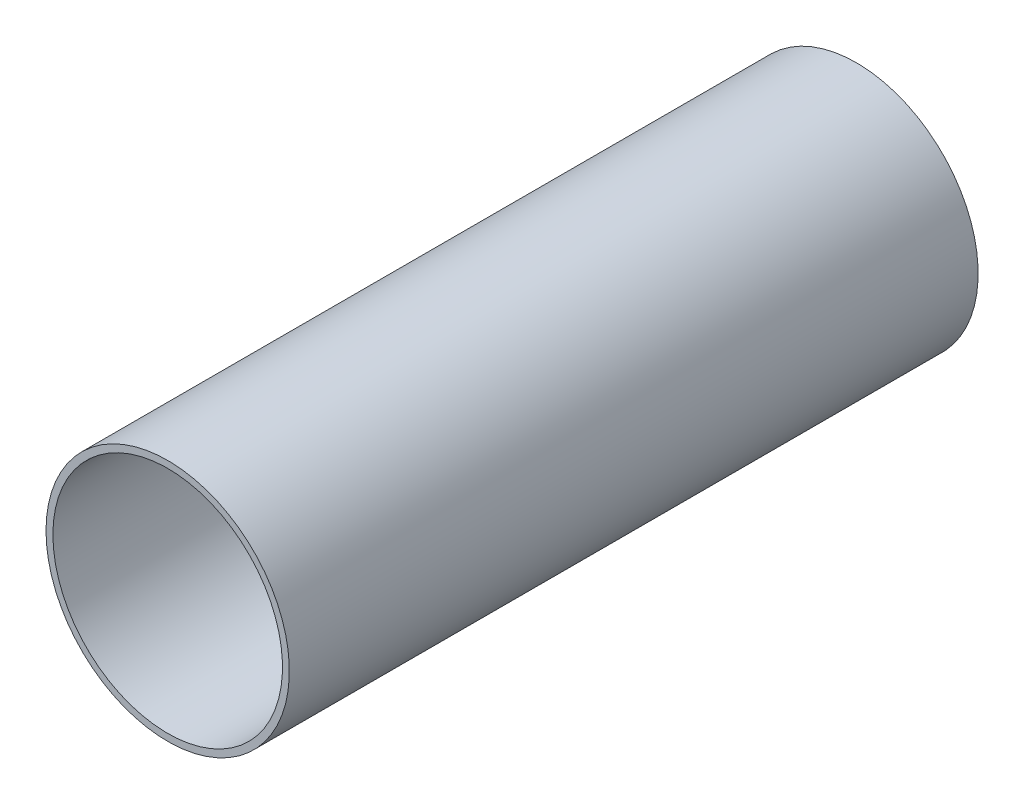
ISO-10303-21;
HEADER;
FILE_DESCRIPTION(('STEP AP214'),'2;1');
FILE_NAME('part.step','',(''),(''),'','','');
FILE_SCHEMA(('AUTOMOTIVE_DESIGN { 1 0 10303 214 1 1 1 1 }'));
ENDSEC;
DATA;
#1=APPLICATION_CONTEXT('core data for automotive mechanical design processes');
#2=APPLICATION_PROTOCOL_DEFINITION('international standard','automotive_design',2000,#1);
#3=PRODUCT_CONTEXT('',#1,'mechanical');
#4=PRODUCT('Part','Part','',(#3));
#5=PRODUCT_RELATED_PRODUCT_CATEGORY('part','',(#4));
#6=PRODUCT_DEFINITION_FORMATION('','',#4);
#7=PRODUCT_DEFINITION_CONTEXT('part definition',#1,'design');
#8=PRODUCT_DEFINITION('design','',#6,#7);
#9=PRODUCT_DEFINITION_SHAPE('','',#8);
#10=(LENGTH_UNIT() NAMED_UNIT(*) SI_UNIT(.MILLI.,.METRE.));
#11=(NAMED_UNIT(*) PLANE_ANGLE_UNIT() SI_UNIT($,.RADIAN.));
#12=(NAMED_UNIT(*) SI_UNIT($,.STERADIAN.) SOLID_ANGLE_UNIT());
#13=UNCERTAINTY_MEASURE_WITH_UNIT(LENGTH_MEASURE(1.E-05),#10,'distance_accuracy_value','');
#14=(GEOMETRIC_REPRESENTATION_CONTEXT(3) GLOBAL_UNCERTAINTY_ASSIGNED_CONTEXT((#13)) GLOBAL_UNIT_ASSIGNED_CONTEXT((#10,
#11,#12)) REPRESENTATION_CONTEXT('',''));
#15=CARTESIAN_POINT('',(0.,0.,0.));
#16=DIRECTION('',(0.,0.,1.));
#17=DIRECTION('',(1.,0.,0.));
#18=AXIS2_PLACEMENT_3D('',#15,#16,#17);
#19=CARTESIAN_POINT('',(0.,0.,76.2));
#20=DIRECTION('',(0.,0.,1.));
#21=DIRECTION('',(1.,0.,0.));
#22=AXIS2_PLACEMENT_3D('',#19,#20,#21);
#23=PLANE('',#22);
#24=CARTESIAN_POINT('',(0.,0.,76.2));
#25=DIRECTION('',(0.,0.,1.));
#26=DIRECTION('',(1.,0.,0.));
#27=AXIS2_PLACEMENT_3D('',#24,#25,#26);
#28=CIRCLE('',#27,13.462);
#29=CARTESIAN_POINT('',(-13.462,0.,76.2));
#30=VERTEX_POINT('',#29);
#31=EDGE_CURVE('E10',#30,#30,#28,.T.);
#32=ORIENTED_EDGE('',*,*,#31,.T.);
#33=EDGE_LOOP('',(#32));
#34=FACE_BOUND('',#33,.T.);
#35=CARTESIAN_POINT('',(0.,0.,76.2));
#36=DIRECTION('',(0.,0.,1.));
#37=DIRECTION('',(1.,0.,0.));
#38=AXIS2_PLACEMENT_3D('',#35,#36,#37);
#39=CIRCLE('',#38,12.7);
#40=CARTESIAN_POINT('',(-12.7,0.,76.2));
#41=VERTEX_POINT('',#40);
#42=EDGE_CURVE('E44',#41,#41,#39,.T.);
#43=ORIENTED_EDGE('',*,*,#42,.F.);
#44=EDGE_LOOP('',(#43));
#45=FACE_BOUND('',#44,.T.);
#46=ADVANCED_FACE('F33',(#34,#45),#23,.T.);
#47=CARTESIAN_POINT('',(0.,0.,0.));
#48=DIRECTION('',(0.,0.,1.));
#49=DIRECTION('',(1.,0.,0.));
#50=AXIS2_PLACEMENT_3D('',#47,#48,#49);
#51=PLANE('',#50);
#52=CARTESIAN_POINT('',(0.,0.,0.));
#53=DIRECTION('',(0.,0.,1.));
#54=DIRECTION('',(1.,0.,0.));
#55=AXIS2_PLACEMENT_3D('',#52,#53,#54);
#56=CIRCLE('',#55,13.462);
#57=CARTESIAN_POINT('',(-13.462,0.,0.));
#58=VERTEX_POINT('',#57);
#59=EDGE_CURVE('E37',#58,#58,#56,.T.);
#60=ORIENTED_EDGE('',*,*,#59,.F.);
#61=EDGE_LOOP('',(#60));
#62=FACE_BOUND('',#61,.T.);
#63=CARTESIAN_POINT('',(0.,0.,0.));
#64=DIRECTION('',(0.,0.,1.));
#65=DIRECTION('',(1.,0.,0.));
#66=AXIS2_PLACEMENT_3D('',#63,#64,#65);
#67=CIRCLE('',#66,12.7);
#68=CARTESIAN_POINT('',(-12.7,0.,0.));
#69=VERTEX_POINT('',#68);
#70=EDGE_CURVE('E46',#69,#69,#67,.T.);
#71=ORIENTED_EDGE('',*,*,#70,.T.);
#72=EDGE_LOOP('',(#71));
#73=FACE_BOUND('',#72,.T.);
#74=ADVANCED_FACE('F56',(#62,#73),#51,.F.);
#75=CARTESIAN_POINT('',(0.,0.,76.2));
#76=DIRECTION('',(0.,0.,-1.));
#77=DIRECTION('',(-1.,0.,0.));
#78=AXIS2_PLACEMENT_3D('',#75,#76,#77);
#79=CYLINDRICAL_SURFACE('',#78,13.462);
#80=CARTESIAN_POINT('',(-13.462,0.,76.2));
#81=CARTESIAN_POINT('',(-13.462,0.,75.40625));
#82=CARTESIAN_POINT('',(-13.462,0.,74.6125));
#83=CARTESIAN_POINT('',(-13.462,0.,73.025));
#84=CARTESIAN_POINT('',(-13.462,0.,72.23125));
#85=CARTESIAN_POINT('',(-13.462,0.,70.64375));
#86=CARTESIAN_POINT('',(-13.462,0.,69.85));
#87=CARTESIAN_POINT('',(-13.462,0.,68.2625));
#88=CARTESIAN_POINT('',(-13.462,0.,67.46875));
#89=CARTESIAN_POINT('',(-13.462,0.,65.88125));
#90=CARTESIAN_POINT('',(-13.462,0.,65.0875));
#91=CARTESIAN_POINT('',(-13.462,0.,63.5));
#92=CARTESIAN_POINT('',(-13.462,0.,62.70625));
#93=CARTESIAN_POINT('',(-13.462,0.,61.11875));
#94=CARTESIAN_POINT('',(-13.462,0.,60.325));
#95=CARTESIAN_POINT('',(-13.462,0.,58.7375));
#96=CARTESIAN_POINT('',(-13.462,0.,57.94375));
#97=CARTESIAN_POINT('',(-13.462,0.,56.35625));
#98=CARTESIAN_POINT('',(-13.462,0.,55.5625));
#99=CARTESIAN_POINT('',(-13.462,0.,53.975));
#100=CARTESIAN_POINT('',(-13.462,0.,53.18125));
#101=CARTESIAN_POINT('',(-13.462,0.,51.59375));
#102=CARTESIAN_POINT('',(-13.462,0.,50.8));
#103=CARTESIAN_POINT('',(-13.462,0.,49.2125));
#104=CARTESIAN_POINT('',(-13.462,0.,48.41875));
#105=CARTESIAN_POINT('',(-13.462,0.,46.83125));
#106=CARTESIAN_POINT('',(-13.462,0.,46.0375));
#107=CARTESIAN_POINT('',(-13.462,0.,44.45));
#108=CARTESIAN_POINT('',(-13.462,0.,43.65625));
#109=CARTESIAN_POINT('',(-13.462,0.,42.06875));
#110=CARTESIAN_POINT('',(-13.462,0.,41.275));
#111=CARTESIAN_POINT('',(-13.462,0.,39.6875));
#112=CARTESIAN_POINT('',(-13.462,0.,38.89375));
#113=CARTESIAN_POINT('',(-13.462,0.,37.30625));
#114=CARTESIAN_POINT('',(-13.462,0.,36.5125));
#115=CARTESIAN_POINT('',(-13.462,0.,34.925));
#116=CARTESIAN_POINT('',(-13.462,0.,34.13125));
#117=CARTESIAN_POINT('',(-13.462,0.,32.54375));
#118=CARTESIAN_POINT('',(-13.462,0.,31.75));
#119=CARTESIAN_POINT('',(-13.462,0.,30.1625));
#120=CARTESIAN_POINT('',(-13.462,0.,29.36875));
#121=CARTESIAN_POINT('',(-13.462,0.,27.78125));
#122=CARTESIAN_POINT('',(-13.462,0.,26.9875));
#123=CARTESIAN_POINT('',(-13.462,0.,25.4));
#124=CARTESIAN_POINT('',(-13.462,0.,24.60625));
#125=CARTESIAN_POINT('',(-13.462,0.,23.01875));
#126=CARTESIAN_POINT('',(-13.462,0.,22.225));
#127=CARTESIAN_POINT('',(-13.462,0.,20.6375));
#128=CARTESIAN_POINT('',(-13.462,0.,19.84375));
#129=CARTESIAN_POINT('',(-13.462,0.,18.25625));
#130=CARTESIAN_POINT('',(-13.462,0.,17.4625));
#131=CARTESIAN_POINT('',(-13.462,0.,15.875));
#132=CARTESIAN_POINT('',(-13.462,0.,15.08125));
#133=CARTESIAN_POINT('',(-13.462,0.,13.49375));
#134=CARTESIAN_POINT('',(-13.462,0.,12.7));
#135=CARTESIAN_POINT('',(-13.462,0.,11.1125));
#136=CARTESIAN_POINT('',(-13.462,0.,10.31875));
#137=CARTESIAN_POINT('',(-13.462,0.,8.73125));
#138=CARTESIAN_POINT('',(-13.462,0.,7.93750000000001));
#139=CARTESIAN_POINT('',(-13.462,0.,6.35));
#140=CARTESIAN_POINT('',(-13.462,0.,5.55625));
#141=CARTESIAN_POINT('',(-13.462,0.,3.96875));
#142=CARTESIAN_POINT('',(-13.462,0.,3.175));
#143=CARTESIAN_POINT('',(-13.462,0.,1.5875));
#144=CARTESIAN_POINT('',(-13.462,0.,0.793750000000001));
#145=CARTESIAN_POINT('',(-13.462,0.,0.));
#146=B_SPLINE_CURVE_WITH_KNOTS('',3,(#80,#81,#82,#83,#84,#85,#86,#87,#88,#89,#90,#91,#92,#93,
#94,#95,#96,#97,#98,#99,#100,#101,#102,#103,#104,#105,#106,#107,#108,#109,#110,#111,#112,#113,
#114,#115,#116,#117,#118,#119,#120,#121,#122,#123,#124,#125,#126,#127,#128,#129,#130,#131,#132,
#133,#134,#135,#136,#137,#138,#139,#140,#141,#142,#143,#144,#145),.UNSPECIFIED.,.F.,.F.,(4,2,2,
2,2,2,2,2,2,2,2,2,2,2,2,2,2,2,2,2,2,2,2,2,2,2,2,2,2,2,2,2,4),(0.,2.38124999999999,
4.76249999999999,7.14374999999999,9.52499999999999,11.90625,14.2875,16.66875,19.05,21.43125,
23.8125,26.19375,28.575,30.95625,33.3375,35.71875,38.1,40.48125,42.8625,45.24375,47.625,
50.00625,52.3875,54.76875,57.15,59.53125,61.9125,64.29375,66.675,69.05625,71.4375,73.81875,
76.2),.UNSPECIFIED.);
#147=EDGE_CURVE('BSEAM35',#30,#58,#146,.T.);
#148=ORIENTED_EDGE('',*,*,#31,.F.);
#149=ORIENTED_EDGE('',*,*,#59,.T.);
#150=ORIENTED_EDGE('',*,*,#147,.T.);
#151=ORIENTED_EDGE('',*,*,#147,.F.);
#152=EDGE_LOOP('',(#148,#150,#149,#151));
#153=FACE_BOUND('',#152,.T.);
#154=ADVANCED_FACE('F35',(#153),#79,.T.);
#155=CARTESIAN_POINT('',(0.,0.,76.2));
#156=DIRECTION('',(0.,0.,-1.));
#157=DIRECTION('',(-1.,0.,0.));
#158=AXIS2_PLACEMENT_3D('',#155,#156,#157);
#159=CYLINDRICAL_SURFACE('',#158,12.7);
#160=CARTESIAN_POINT('',(-12.7,0.,76.2));
#161=CARTESIAN_POINT('',(-12.7,0.,75.40625));
#162=CARTESIAN_POINT('',(-12.7,0.,74.6125));
#163=CARTESIAN_POINT('',(-12.7,0.,73.025));
#164=CARTESIAN_POINT('',(-12.7,0.,72.23125));
#165=CARTESIAN_POINT('',(-12.7,0.,70.64375));
#166=CARTESIAN_POINT('',(-12.7,0.,69.85));
#167=CARTESIAN_POINT('',(-12.7,0.,68.2625));
#168=CARTESIAN_POINT('',(-12.7,0.,67.46875));
#169=CARTESIAN_POINT('',(-12.7,0.,65.88125));
#170=CARTESIAN_POINT('',(-12.7,0.,65.0875));
#171=CARTESIAN_POINT('',(-12.7,0.,63.5));
#172=CARTESIAN_POINT('',(-12.7,0.,62.70625));
#173=CARTESIAN_POINT('',(-12.7,0.,61.11875));
#174=CARTESIAN_POINT('',(-12.7,0.,60.325));
#175=CARTESIAN_POINT('',(-12.7,0.,58.7375));
#176=CARTESIAN_POINT('',(-12.7,0.,57.94375));
#177=CARTESIAN_POINT('',(-12.7,0.,56.35625));
#178=CARTESIAN_POINT('',(-12.7,0.,55.5625));
#179=CARTESIAN_POINT('',(-12.7,0.,53.975));
#180=CARTESIAN_POINT('',(-12.7,0.,53.18125));
#181=CARTESIAN_POINT('',(-12.7,0.,51.59375));
#182=CARTESIAN_POINT('',(-12.7,0.,50.8));
#183=CARTESIAN_POINT('',(-12.7,0.,49.2125));
#184=CARTESIAN_POINT('',(-12.7,0.,48.41875));
#185=CARTESIAN_POINT('',(-12.7,0.,46.83125));
#186=CARTESIAN_POINT('',(-12.7,0.,46.0375));
#187=CARTESIAN_POINT('',(-12.7,0.,44.45));
#188=CARTESIAN_POINT('',(-12.7,0.,43.65625));
#189=CARTESIAN_POINT('',(-12.7,0.,42.06875));
#190=CARTESIAN_POINT('',(-12.7,0.,41.275));
#191=CARTESIAN_POINT('',(-12.7,0.,39.6875));
#192=CARTESIAN_POINT('',(-12.7,0.,38.89375));
#193=CARTESIAN_POINT('',(-12.7,0.,37.30625));
#194=CARTESIAN_POINT('',(-12.7,0.,36.5125));
#195=CARTESIAN_POINT('',(-12.7,0.,34.925));
#196=CARTESIAN_POINT('',(-12.7,0.,34.13125));
#197=CARTESIAN_POINT('',(-12.7,0.,32.54375));
#198=CARTESIAN_POINT('',(-12.7,0.,31.75));
#199=CARTESIAN_POINT('',(-12.7,0.,30.1625));
#200=CARTESIAN_POINT('',(-12.7,0.,29.36875));
#201=CARTESIAN_POINT('',(-12.7,0.,27.78125));
#202=CARTESIAN_POINT('',(-12.7,0.,26.9875));
#203=CARTESIAN_POINT('',(-12.7,0.,25.4));
#204=CARTESIAN_POINT('',(-12.7,0.,24.60625));
#205=CARTESIAN_POINT('',(-12.7,0.,23.01875));
#206=CARTESIAN_POINT('',(-12.7,0.,22.225));
#207=CARTESIAN_POINT('',(-12.7,0.,20.6375));
#208=CARTESIAN_POINT('',(-12.7,0.,19.84375));
#209=CARTESIAN_POINT('',(-12.7,0.,18.25625));
#210=CARTESIAN_POINT('',(-12.7,0.,17.4625));
#211=CARTESIAN_POINT('',(-12.7,0.,15.875));
#212=CARTESIAN_POINT('',(-12.7,0.,15.08125));
#213=CARTESIAN_POINT('',(-12.7,0.,13.49375));
#214=CARTESIAN_POINT('',(-12.7,0.,12.7));
#215=CARTESIAN_POINT('',(-12.7,0.,11.1125));
#216=CARTESIAN_POINT('',(-12.7,0.,10.31875));
#217=CARTESIAN_POINT('',(-12.7,0.,8.73125));
#218=CARTESIAN_POINT('',(-12.7,0.,7.93750000000001));
#219=CARTESIAN_POINT('',(-12.7,0.,6.35));
#220=CARTESIAN_POINT('',(-12.7,0.,5.55625));
#221=CARTESIAN_POINT('',(-12.7,0.,3.96875));
#222=CARTESIAN_POINT('',(-12.7,0.,3.175));
#223=CARTESIAN_POINT('',(-12.7,0.,1.5875));
#224=CARTESIAN_POINT('',(-12.7,0.,0.793750000000001));
#225=CARTESIAN_POINT('',(-12.7,0.,0.));
#226=B_SPLINE_CURVE_WITH_KNOTS('',3,(#160,#161,#162,#163,#164,#165,#166,#167,#168,#169,#170,
#171,#172,#173,#174,#175,#176,#177,#178,#179,#180,#181,#182,#183,#184,#185,#186,#187,#188,#189,
#190,#191,#192,#193,#194,#195,#196,#197,#198,#199,#200,#201,#202,#203,#204,#205,#206,#207,#208,
#209,#210,#211,#212,#213,#214,#215,#216,#217,#218,#219,#220,#221,#222,#223,#224,#225),
.UNSPECIFIED.,.F.,.F.,(4,2,2,2,2,2,2,2,2,2,2,2,2,2,2,2,2,2,2,2,2,2,2,2,2,2,2,2,2,2,2,2,4),(0.,
2.38124999999999,4.76249999999999,7.14374999999999,9.52499999999999,11.90625,14.2875,16.66875,
19.05,21.43125,23.8125,26.19375,28.575,30.95625,33.3375,35.71875,38.1,40.48125,42.8625,45.24375,
47.625,50.00625,52.3875,54.76875,57.15,59.53125,61.9125,64.29375,66.675,69.05625,71.4375,
73.81875,76.2),.UNSPECIFIED.);
#227=EDGE_CURVE('BSEAM52',#41,#69,#226,.T.);
#228=ORIENTED_EDGE('',*,*,#42,.T.);
#229=ORIENTED_EDGE('',*,*,#70,.F.);
#230=ORIENTED_EDGE('',*,*,#227,.T.);
#231=ORIENTED_EDGE('',*,*,#227,.F.);
#232=EDGE_LOOP('',(#228,#230,#229,#231));
#233=FACE_BOUND('',#232,.T.);
#234=ADVANCED_FACE('F52',(#233),#159,.F.);
#235=CLOSED_SHELL('',(#46,#74,#154,#234));
#236=MANIFOLD_SOLID_BREP('B2',#235);
#237=ADVANCED_BREP_SHAPE_REPRESENTATION('',(#18,#236),#14);
#238=SHAPE_DEFINITION_REPRESENTATION(#9,#237);
ENDSEC;
END-ISO-10303-21;
